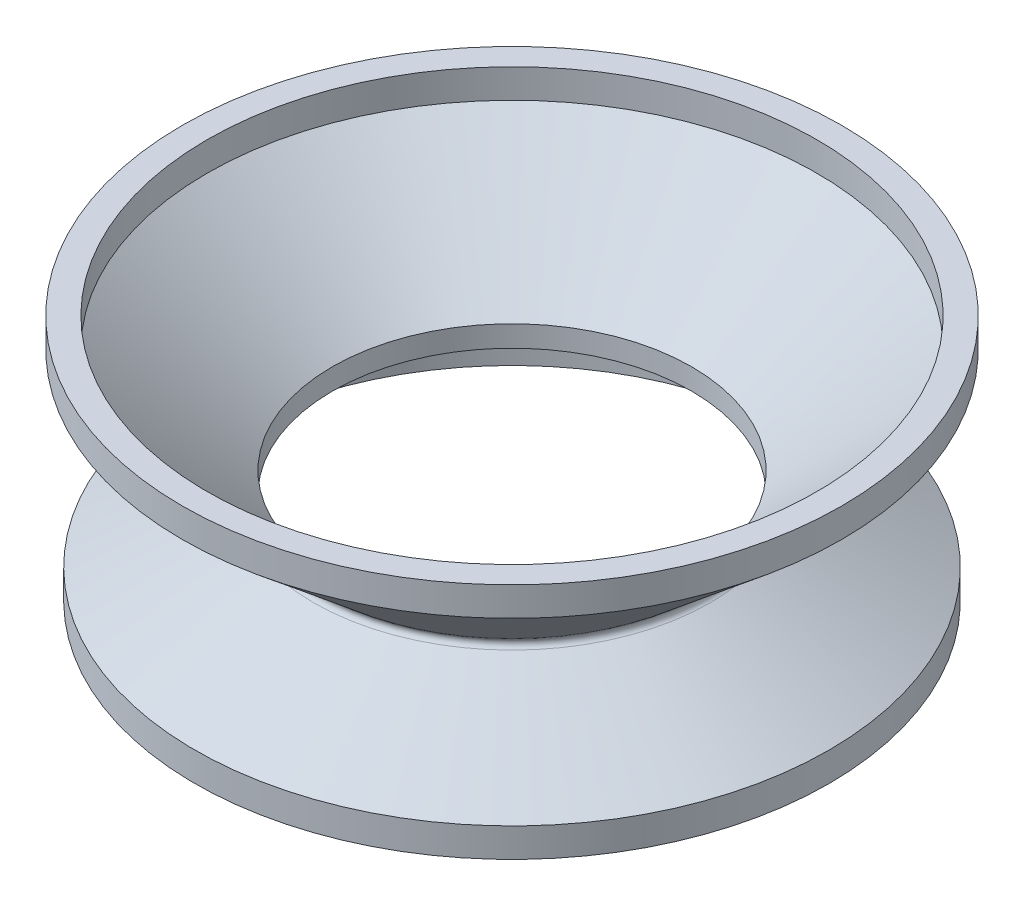
ISO-10303-21;
HEADER;
FILE_DESCRIPTION(('STEP AP214'),'2;1');
FILE_NAME('part.step','',(''),(''),'','','');
FILE_SCHEMA(('AUTOMOTIVE_DESIGN { 1 0 10303 214 1 1 1 1 }'));
ENDSEC;
DATA;
#1=APPLICATION_CONTEXT('core data for automotive mechanical design processes');
#2=APPLICATION_PROTOCOL_DEFINITION('international standard','automotive_design',2000,#1);
#3=PRODUCT_CONTEXT('',#1,'mechanical');
#4=PRODUCT('Part','Part','',(#3));
#5=PRODUCT_RELATED_PRODUCT_CATEGORY('part','',(#4));
#6=PRODUCT_DEFINITION_FORMATION('','',#4);
#7=PRODUCT_DEFINITION_CONTEXT('part definition',#1,'design');
#8=PRODUCT_DEFINITION('design','',#6,#7);
#9=PRODUCT_DEFINITION_SHAPE('','',#8);
#10=(LENGTH_UNIT() NAMED_UNIT(*) SI_UNIT(.MILLI.,.METRE.));
#11=(NAMED_UNIT(*) PLANE_ANGLE_UNIT() SI_UNIT($,.RADIAN.));
#12=(NAMED_UNIT(*) SI_UNIT($,.STERADIAN.) SOLID_ANGLE_UNIT());
#13=UNCERTAINTY_MEASURE_WITH_UNIT(LENGTH_MEASURE(1.E-05),#10,'distance_accuracy_value','');
#14=(GEOMETRIC_REPRESENTATION_CONTEXT(3) GLOBAL_UNCERTAINTY_ASSIGNED_CONTEXT((#13)) GLOBAL_UNIT_ASSIGNED_CONTEXT((#10,
#11,#12)) REPRESENTATION_CONTEXT('',''));
#15=CARTESIAN_POINT('',(0.,0.,0.));
#16=DIRECTION('',(0.,0.,1.));
#17=DIRECTION('',(1.,0.,0.));
#18=AXIS2_PLACEMENT_3D('',#15,#16,#17);
#19=CARTESIAN_POINT('',(13.8400494214266,0.,0.));
#20=DIRECTION('',(0.,-1.,0.));
#21=DIRECTION('',(1.,0.,0.));
#22=AXIS2_PLACEMENT_3D('',#19,#20,#21);
#23=CONICAL_SURFACE('',#22,13.1772674687927,1.0471975511966);
#24=CARTESIAN_POINT('',(13.8400494214266,-0.285629601348422,0.));
#25=DIRECTION('',(0.,-1.,0.));
#26=DIRECTION('',(1.,0.,0.));
#27=AXIS2_PLACEMENT_3D('',#24,#25,#26);
#28=CIRCLE('',#27,13.6719924504738);
#29=CARTESIAN_POINT('',(27.5120418719004,-0.28562960134842,0.));
#30=VERTEX_POINT('',#29);
#31=EDGE_CURVE('E10',#30,#30,#28,.T.);
#32=ORIENTED_EDGE('',*,*,#31,.T.);
#33=EDGE_LOOP('',(#32));
#34=FACE_BOUND('',#33,.T.);
#35=CARTESIAN_POINT('',(13.8400494214266,-5.,0.));
#36=DIRECTION('',(0.,-1.,0.));
#37=DIRECTION('',(1.,0.,0.));
#38=AXIS2_PLACEMENT_3D('',#35,#36,#37);
#39=CIRCLE('',#38,21.8375215066372);
#40=CARTESIAN_POINT('',(35.6775709280638,-4.99999999999999,0.));
#41=VERTEX_POINT('',#40);
#42=EDGE_CURVE('E88',#41,#41,#39,.T.);
#43=ORIENTED_EDGE('',*,*,#42,.F.);
#44=EDGE_LOOP('',(#43));
#45=FACE_BOUND('',#44,.T.);
#46=ADVANCED_FACE('F43',(#34,#45),#23,.T.);
#47=CARTESIAN_POINT('',(13.8400494214266,8.,0.));
#48=DIRECTION('',(0.,1.,0.));
#49=DIRECTION('',(-1.,0.,0.));
#50=AXIS2_PLACEMENT_3D('',#47,#48,#49);
#51=CONICAL_SURFACE('',#50,22.7112962095465,0.87266462599717);
#52=CARTESIAN_POINT('',(13.8400494214266,0.367198337412951,0.));
#53=DIRECTION('',(0.,1.,0.));
#54=DIRECTION('',(-1.,0.,0.));
#55=AXIS2_PLACEMENT_3D('',#52,#53,#54);
#56=CIRCLE('',#55,13.6148774065992);
#57=CARTESIAN_POINT('',(0.225172014827456,0.367198337412949,0.));
#58=VERTEX_POINT('',#57);
#59=EDGE_CURVE('E51',#58,#58,#56,.T.);
#60=ORIENTED_EDGE('',*,*,#59,.T.);
#61=EDGE_LOOP('',(#60));
#62=FACE_BOUND('',#61,.T.);
#63=CARTESIAN_POINT('',(13.8400494214266,8.,0.));
#64=DIRECTION('',(0.,1.,0.));
#65=DIRECTION('',(-1.,0.,0.));
#66=AXIS2_PLACEMENT_3D('',#63,#64,#65);
#67=CIRCLE('',#66,22.7112962095465);
#68=CARTESIAN_POINT('',(-8.87124678811983,8.,0.));
#69=VERTEX_POINT('',#68);
#70=EDGE_CURVE('E56',#69,#69,#67,.T.);
#71=ORIENTED_EDGE('',*,*,#70,.F.);
#72=EDGE_LOOP('',(#71));
#73=FACE_BOUND('',#72,.T.);
#74=ADVANCED_FACE('F120',(#62,#73),#51,.T.);
#75=CARTESIAN_POINT('',(13.8400494214266,0.764668313323685,0.));
#76=DIRECTION('',(0.,1.,0.));
#77=DIRECTION('',(-1.,0.,0.));
#78=AXIS2_PLACEMENT_3D('',#75,#76,#77);
#79=CONICAL_SURFACE('',#78,12.3772674687927,0.872664625997171);
#80=CARTESIAN_POINT('',(13.8400494214266,8.,0.));
#81=DIRECTION('',(0.,1.,0.));
#82=DIRECTION('',(-1.,0.,0.));
#83=AXIS2_PLACEMENT_3D('',#80,#81,#82);
#84=CIRCLE('',#83,21.);
#85=CARTESIAN_POINT('',(-7.15995057857336,8.,0.));
#86=VERTEX_POINT('',#85);
#87=EDGE_CURVE('E80',#86,#86,#84,.T.);
#88=ORIENTED_EDGE('',*,*,#87,.T.);
#89=EDGE_LOOP('',(#88));
#90=FACE_BOUND('',#89,.T.);
#91=CARTESIAN_POINT('',(13.8400494214266,0.764668313323685,0.));
#92=DIRECTION('',(0.,1.,0.));
#93=DIRECTION('',(-1.,0.,0.));
#94=AXIS2_PLACEMENT_3D('',#91,#92,#93);
#95=CIRCLE('',#94,12.3772674687927);
#96=CARTESIAN_POINT('',(1.46278195263397,0.764668313323684,0.));
#97=VERTEX_POINT('',#96);
#98=EDGE_CURVE('E61',#97,#97,#95,.T.);
#99=ORIENTED_EDGE('',*,*,#98,.F.);
#100=EDGE_LOOP('',(#99));
#101=FACE_BOUND('',#100,.T.);
#102=ADVANCED_FACE('F125',(#90,#101),#79,.F.);
#103=CARTESIAN_POINT('',(13.8400494214266,7.60901803281974,0.));
#104=DIRECTION('',(0.,1.,0.));
#105=DIRECTION('',(-1.,0.,0.));
#106=AXIS2_PLACEMENT_3D('',#103,#104,#105);
#107=CYLINDRICAL_SURFACE('',#106,12.3772674687927);
#108=ORIENTED_EDGE('',*,*,#98,.T.);
#109=EDGE_LOOP('',(#108));
#110=FACE_BOUND('',#109,.T.);
#111=CARTESIAN_POINT('',(13.8400494214266,-0.692820323027552,0.));
#112=DIRECTION('',(0.,1.,0.));
#113=DIRECTION('',(-1.,0.,0.));
#114=AXIS2_PLACEMENT_3D('',#111,#112,#113);
#115=CIRCLE('',#114,12.3772674687927);
#116=CARTESIAN_POINT('',(1.46278195263397,-0.692820323027553,0.));
#117=VERTEX_POINT('',#116);
#118=EDGE_CURVE('E67',#117,#117,#115,.T.);
#119=ORIENTED_EDGE('',*,*,#118,.F.);
#120=EDGE_LOOP('',(#119));
#121=FACE_BOUND('',#120,.T.);
#122=ADVANCED_FACE('F131',(#110,#121),#107,.F.);
#123=CARTESIAN_POINT('',(13.8400494214266,-5.,0.));
#124=DIRECTION('',(0.,-1.,0.));
#125=DIRECTION('',(1.,0.,0.));
#126=AXIS2_PLACEMENT_3D('',#123,#124,#125);
#127=CONICAL_SURFACE('',#126,19.8375215066372,1.0471975511966);
#128=ORIENTED_EDGE('',*,*,#118,.T.);
#129=EDGE_LOOP('',(#128));
#130=FACE_BOUND('',#129,.T.);
#131=CARTESIAN_POINT('',(13.8400494214266,-5.,0.));
#132=DIRECTION('',(0.,1.,0.));
#133=DIRECTION('',(-1.,0.,0.));
#134=AXIS2_PLACEMENT_3D('',#131,#132,#133);
#135=CIRCLE('',#134,19.8375215066372);
#136=CARTESIAN_POINT('',(-5.99747208521052,-5.,0.));
#137=VERTEX_POINT('',#136);
#138=EDGE_CURVE('E71',#137,#137,#135,.T.);
#139=ORIENTED_EDGE('',*,*,#138,.F.);
#140=EDGE_LOOP('',(#139));
#141=FACE_BOUND('',#140,.T.);
#142=ADVANCED_FACE('F135',(#130,#141),#127,.F.);
#143=CARTESIAN_POINT('',(13.8400494214266,0.0607805601653541,0.));
#144=DIRECTION('',(0.,1.,0.));
#145=DIRECTION('',(-1.,0.,0.));
#146=AXIS2_PLACEMENT_3D('',#143,#144,#145);
#147=TOROIDAL_SURFACE('',#146,13.8719924504738,0.4);
#148=ORIENTED_EDGE('',*,*,#31,.F.);
#149=EDGE_LOOP('',(#148));
#150=FACE_BOUND('',#149,.T.);
#151=ORIENTED_EDGE('',*,*,#59,.F.);
#152=EDGE_LOOP('',(#151));
#153=FACE_BOUND('',#152,.T.);
#154=ADVANCED_FACE('F45',(#150,#153),#147,.F.);
#155=CARTESIAN_POINT('',(13.8400494214266,10.,0.));
#156=DIRECTION('',(0.,1.,0.));
#157=DIRECTION('',(-1.,0.,0.));
#158=AXIS2_PLACEMENT_3D('',#155,#156,#157);
#159=PLANE('',#158);
#160=CARTESIAN_POINT('',(13.8400494214266,10.,0.));
#161=DIRECTION('',(0.,1.,0.));
#162=DIRECTION('',(-1.,0.,0.));
#163=AXIS2_PLACEMENT_3D('',#160,#161,#162);
#164=CIRCLE('',#163,22.7112962095465);
#165=CARTESIAN_POINT('',(-8.87124678811982,10.,0.));
#166=VERTEX_POINT('',#165);
#167=EDGE_CURVE('E75',#166,#166,#164,.T.);
#168=ORIENTED_EDGE('',*,*,#167,.T.);
#169=EDGE_LOOP('',(#168));
#170=FACE_BOUND('',#169,.T.);
#171=CARTESIAN_POINT('',(13.8400494214266,10.,0.));
#172=DIRECTION('',(0.,1.,0.));
#173=DIRECTION('',(-1.,0.,0.));
#174=AXIS2_PLACEMENT_3D('',#171,#172,#173);
#175=CIRCLE('',#174,21.);
#176=CARTESIAN_POINT('',(-7.15995057857336,10.,0.));
#177=VERTEX_POINT('',#176);
#178=EDGE_CURVE('E79',#177,#177,#175,.T.);
#179=ORIENTED_EDGE('',*,*,#178,.F.);
#180=EDGE_LOOP('',(#179));
#181=FACE_BOUND('',#180,.T.);
#182=ADVANCED_FACE('F141',(#170,#181),#159,.T.);
#183=CARTESIAN_POINT('',(13.8400494214266,10.,0.));
#184=DIRECTION('',(0.,-1.,0.));
#185=DIRECTION('',(1.,0.,0.));
#186=AXIS2_PLACEMENT_3D('',#183,#184,#185);
#187=CYLINDRICAL_SURFACE('',#186,22.7112962095465);
#188=ORIENTED_EDGE('',*,*,#167,.F.);
#189=EDGE_LOOP('',(#188));
#190=FACE_BOUND('',#189,.T.);
#191=ORIENTED_EDGE('',*,*,#70,.T.);
#192=EDGE_LOOP('',(#191));
#193=FACE_BOUND('',#192,.T.);
#194=ADVANCED_FACE('F115',(#190,#193),#187,.T.);
#195=CARTESIAN_POINT('',(13.8400494214266,10.,0.));
#196=DIRECTION('',(0.,-1.,0.));
#197=DIRECTION('',(1.,0.,0.));
#198=AXIS2_PLACEMENT_3D('',#195,#196,#197);
#199=CYLINDRICAL_SURFACE('',#198,21.);
#200=ORIENTED_EDGE('',*,*,#178,.T.);
#201=EDGE_LOOP('',(#200));
#202=FACE_BOUND('',#201,.T.);
#203=ORIENTED_EDGE('',*,*,#87,.F.);
#204=EDGE_LOOP('',(#203));
#205=FACE_BOUND('',#204,.T.);
#206=ADVANCED_FACE('F106',(#202,#205),#199,.F.);
#207=CARTESIAN_POINT('',(13.8400494214266,-6.99999999999999,0.));
#208=DIRECTION('',(0.,-1.,0.));
#209=DIRECTION('',(1.,0.,0.));
#210=AXIS2_PLACEMENT_3D('',#207,#208,#209);
#211=PLANE('',#210);
#212=CARTESIAN_POINT('',(13.8400494214266,-6.99999999999999,0.));
#213=DIRECTION('',(0.,-1.,0.));
#214=DIRECTION('',(1.,0.,0.));
#215=AXIS2_PLACEMENT_3D('',#212,#213,#214);
#216=CIRCLE('',#215,21.8375215066372);
#217=CARTESIAN_POINT('',(35.6775709280638,-6.99999999999999,0.));
#218=VERTEX_POINT('',#217);
#219=EDGE_CURVE('E84',#218,#218,#216,.T.);
#220=ORIENTED_EDGE('',*,*,#219,.T.);
#221=EDGE_LOOP('',(#220));
#222=FACE_BOUND('',#221,.T.);
#223=CARTESIAN_POINT('',(13.8400494214266,-6.99999999999999,0.));
#224=DIRECTION('',(0.,-1.,0.));
#225=DIRECTION('',(1.,0.,0.));
#226=AXIS2_PLACEMENT_3D('',#223,#224,#225);
#227=CIRCLE('',#226,19.8375215066372);
#228=CARTESIAN_POINT('',(33.6775709280638,-6.99999999999999,0.));
#229=VERTEX_POINT('',#228);
#230=EDGE_CURVE('E92',#229,#229,#227,.T.);
#231=ORIENTED_EDGE('',*,*,#230,.F.);
#232=EDGE_LOOP('',(#231));
#233=FACE_BOUND('',#232,.T.);
#234=ADVANCED_FACE('F103',(#222,#233),#211,.T.);
#235=CARTESIAN_POINT('',(13.8400494214266,-6.99999999999999,0.));
#236=DIRECTION('',(0.,1.,0.));
#237=DIRECTION('',(-1.,0.,0.));
#238=AXIS2_PLACEMENT_3D('',#235,#236,#237);
#239=CYLINDRICAL_SURFACE('',#238,21.8375215066372);
#240=ORIENTED_EDGE('',*,*,#219,.F.);
#241=EDGE_LOOP('',(#240));
#242=FACE_BOUND('',#241,.T.);
#243=ORIENTED_EDGE('',*,*,#42,.T.);
#244=EDGE_LOOP('',(#243));
#245=FACE_BOUND('',#244,.T.);
#246=ADVANCED_FACE('F105',(#242,#245),#239,.T.);
#247=CARTESIAN_POINT('',(13.8400494214266,-6.99999999999999,0.));
#248=DIRECTION('',(0.,1.,0.));
#249=DIRECTION('',(-1.,0.,0.));
#250=AXIS2_PLACEMENT_3D('',#247,#248,#249);
#251=CYLINDRICAL_SURFACE('',#250,19.8375215066372);
#252=ORIENTED_EDGE('',*,*,#230,.T.);
#253=EDGE_LOOP('',(#252));
#254=FACE_BOUND('',#253,.T.);
#255=ORIENTED_EDGE('',*,*,#138,.T.);
#256=EDGE_LOOP('',(#255));
#257=FACE_BOUND('',#256,.T.);
#258=ADVANCED_FACE('F100',(#254,#257),#251,.F.);
#259=CLOSED_SHELL('',(#46,#74,#102,#122,#142,#154,#182,#194,#206,#234,#246,#258));
#260=MANIFOLD_SOLID_BREP('B2',#259);
#261=ADVANCED_BREP_SHAPE_REPRESENTATION('',(#18,#260),#14);
#262=SHAPE_DEFINITION_REPRESENTATION(#9,#261);
ENDSEC;
END-ISO-10303-21;
